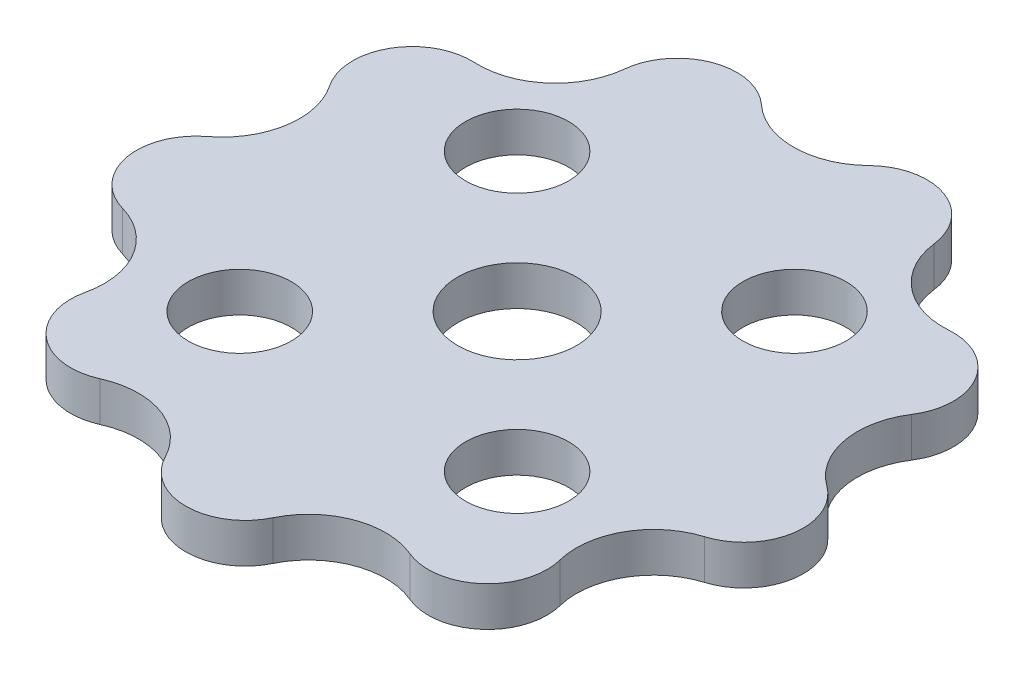
ISO-10303-21;
HEADER;
FILE_DESCRIPTION(('STEP AP214'),'2;1');
FILE_NAME('part.step','',(''),(''),'','','');
FILE_SCHEMA(('AUTOMOTIVE_DESIGN { 1 0 10303 214 1 1 1 1 }'));
ENDSEC;
DATA;
#1=APPLICATION_CONTEXT('core data for automotive mechanical design processes');
#2=APPLICATION_PROTOCOL_DEFINITION('international standard','automotive_design',2000,#1);
#3=PRODUCT_CONTEXT('',#1,'mechanical');
#4=PRODUCT('Part','Part','',(#3));
#5=PRODUCT_RELATED_PRODUCT_CATEGORY('part','',(#4));
#6=PRODUCT_DEFINITION_FORMATION('','',#4);
#7=PRODUCT_DEFINITION_CONTEXT('part definition',#1,'design');
#8=PRODUCT_DEFINITION('design','',#6,#7);
#9=PRODUCT_DEFINITION_SHAPE('','',#8);
#10=(LENGTH_UNIT() NAMED_UNIT(*) SI_UNIT(.MILLI.,.METRE.));
#11=(NAMED_UNIT(*) PLANE_ANGLE_UNIT() SI_UNIT($,.RADIAN.));
#12=(NAMED_UNIT(*) SI_UNIT($,.STERADIAN.) SOLID_ANGLE_UNIT());
#13=UNCERTAINTY_MEASURE_WITH_UNIT(LENGTH_MEASURE(1.E-05),#10,'distance_accuracy_value','');
#14=(GEOMETRIC_REPRESENTATION_CONTEXT(3) GLOBAL_UNCERTAINTY_ASSIGNED_CONTEXT((#13)) GLOBAL_UNIT_ASSIGNED_CONTEXT((#10,
#11,#12)) REPRESENTATION_CONTEXT('',''));
#15=CARTESIAN_POINT('',(0.,0.,0.));
#16=DIRECTION('',(0.,0.,1.));
#17=DIRECTION('',(1.,0.,0.));
#18=AXIS2_PLACEMENT_3D('',#15,#16,#17);
#19=CARTESIAN_POINT('',(22.9976137655761,10.,-65.5));
#20=DIRECTION('',(0.,-1.,0.));
#21=DIRECTION('',(0.,0.,-1.));
#22=AXIS2_PLACEMENT_3D('',#19,#20,#21);
#23=CYLINDRICAL_SURFACE('',#22,15.);
#24=CARTESIAN_POINT('',(22.9976137655761,0.,-65.5));
#25=DIRECTION('',(0.,1.,0.));
#26=DIRECTION('',(0.,0.,-1.));
#27=AXIS2_PLACEMENT_3D('',#24,#25,#26);
#28=CIRCLE('',#27,15.);
#29=CARTESIAN_POINT('',(37.8804715506332,0.,-67.3709741178769));
#30=VERTEX_POINT('',#29);
#31=CARTESIAN_POINT('',(12.5511192146518,0.,-76.2643277355119));
#32=VERTEX_POINT('',#31);
#33=EDGE_CURVE('E190',#30,#32,#28,.T.);
#34=ORIENTED_EDGE('',*,*,#33,.T.);
#35=DIRECTION('',(0.,-1.,0.));
#36=VECTOR('',#35,1.);
#37=CARTESIAN_POINT('',(12.5511192146518,10.,-76.2643277355119));
#38=LINE('',#37,#36);
#39=CARTESIAN_POINT('',(12.5511192146518,10.,-76.2643277355119));
#40=VERTEX_POINT('',#39);
#41=EDGE_CURVE('E11',#40,#32,#38,.T.);
#42=ORIENTED_EDGE('',*,*,#41,.F.);
#43=CARTESIAN_POINT('',(22.9976137655761,10.,-65.5));
#44=DIRECTION('',(0.,1.,0.));
#45=DIRECTION('',(0.,0.,-1.));
#46=AXIS2_PLACEMENT_3D('',#43,#44,#45);
#47=CIRCLE('',#46,15.);
#48=CARTESIAN_POINT('',(37.8804715506332,10.,-67.3709741178769));
#49=VERTEX_POINT('',#48);
#50=EDGE_CURVE('E225',#49,#40,#47,.T.);
#51=ORIENTED_EDGE('',*,*,#50,.F.);
#52=DIRECTION('',(0.,-1.,0.));
#53=VECTOR('',#52,1.);
#54=CARTESIAN_POINT('',(37.8804715506332,10.,-67.3709741178769));
#55=LINE('',#54,#53);
#56=EDGE_CURVE('E186',#49,#30,#55,.T.);
#57=ORIENTED_EDGE('',*,*,#56,.T.);
#58=EDGE_LOOP('',(#34,#42,#51,#57));
#59=FACE_BOUND('',#58,.T.);
#60=ADVANCED_FACE('F34',(#59),#23,.T.);
#61=CARTESIAN_POINT('',(-1.0293237015498,10.,-90.2579537916773));
#62=DIRECTION('',(0.,-1.,0.));
#63=DIRECTION('',(0.,0.,-1.));
#64=AXIS2_PLACEMENT_3D('',#61,#62,#63);
#65=CYLINDRICAL_SURFACE('',#64,19.5);
#66=CARTESIAN_POINT('',(-1.0293237015498,0.,-90.2579537916773));
#67=DIRECTION('',(0.,-1.,0.));
#68=DIRECTION('',(0.,0.,1.));
#69=AXIS2_PLACEMENT_3D('',#66,#67,#68);
#70=CIRCLE('',#69,19.5);
#71=CARTESIAN_POINT('',(-14.2871026813947,0.,-75.9582581123425));
#72=VERTEX_POINT('',#71);
#73=EDGE_CURVE('E193',#32,#72,#70,.T.);
#74=ORIENTED_EDGE('',*,*,#73,.T.);
#75=DIRECTION('',(0.,-1.,0.));
#76=VECTOR('',#75,1.);
#77=CARTESIAN_POINT('',(-14.2871026813947,10.,-75.9582581123425));
#78=LINE('',#77,#76);
#79=CARTESIAN_POINT('',(-14.2871026813947,10.,-75.9582581123425));
#80=VERTEX_POINT('',#79);
#81=EDGE_CURVE('E42',#80,#72,#78,.T.);
#82=ORIENTED_EDGE('',*,*,#81,.F.);
#83=CARTESIAN_POINT('',(-1.0293237015498,10.,-90.2579537916773));
#84=DIRECTION('',(0.,-1.,0.));
#85=DIRECTION('',(0.,0.,1.));
#86=AXIS2_PLACEMENT_3D('',#83,#84,#85);
#87=CIRCLE('',#86,19.5);
#88=EDGE_CURVE('E123',#40,#80,#87,.T.);
#89=ORIENTED_EDGE('',*,*,#88,.F.);
#90=ORIENTED_EDGE('',*,*,#41,.T.);
#91=EDGE_LOOP('',(#74,#82,#89,#90));
#92=FACE_BOUND('',#91,.T.);
#93=ADVANCED_FACE('F334',(#92),#65,.F.);
#94=CARTESIAN_POINT('',(-24.4853942043523,10.,-64.9584922051619));
#95=DIRECTION('',(0.,-1.,0.));
#96=DIRECTION('',(0.,0.,-1.));
#97=AXIS2_PLACEMENT_3D('',#94,#95,#96);
#98=CYLINDRICAL_SURFACE('',#97,15.0000000000001);
#99=CARTESIAN_POINT('',(-24.4853942043523,0.,-64.9584922051619));
#100=DIRECTION('',(0.,1.,0.));
#101=DIRECTION('',(0.,0.,-1.));
#102=AXIS2_PLACEMENT_3D('',#99,#100,#101);
#103=CIRCLE('',#102,15.0000000000001);
#104=CARTESIAN_POINT('',(-39.4070498001527,0.,-66.4895683888702));
#105=VERTEX_POINT('',#104);
#106=EDGE_CURVE('E196',#72,#105,#103,.T.);
#107=ORIENTED_EDGE('',*,*,#106,.T.);
#108=DIRECTION('',(0.,-1.,0.));
#109=VECTOR('',#108,1.);
#110=CARTESIAN_POINT('',(-39.4070498001527,10.,-66.4895683888702));
#111=LINE('',#110,#109);
#112=CARTESIAN_POINT('',(-39.4070498001527,10.,-66.4895683888702));
#113=VERTEX_POINT('',#112);
#114=EDGE_CURVE('E262',#113,#105,#111,.T.);
#115=ORIENTED_EDGE('',*,*,#114,.F.);
#116=CARTESIAN_POINT('',(-24.4853942043523,10.,-64.9584922051619));
#117=DIRECTION('',(0.,1.,0.));
#118=DIRECTION('',(0.,0.,-1.));
#119=AXIS2_PLACEMENT_3D('',#116,#117,#118);
#120=CIRCLE('',#119,15.0000000000001);
#121=EDGE_CURVE('E270',#80,#113,#120,.T.);
#122=ORIENTED_EDGE('',*,*,#121,.F.);
#123=ORIENTED_EDGE('',*,*,#81,.T.);
#124=EDGE_LOOP('',(#107,#115,#122,#123));
#125=FACE_BOUND('',#124,.T.);
#126=ADVANCED_FACE('F268',(#125),#98,.T.);
#127=CARTESIAN_POINT('',(-58.8052020746933,10.,-68.4799674276909));
#128=DIRECTION('',(0.,-1.,0.));
#129=DIRECTION('',(0.,0.,-1.));
#130=AXIS2_PLACEMENT_3D('',#127,#128,#129);
#131=CYLINDRICAL_SURFACE('',#130,19.5);
#132=CARTESIAN_POINT('',(-58.8052020746933,0.,-68.4799674276909));
#133=DIRECTION('',(0.,-1.,0.));
#134=DIRECTION('',(0.,0.,1.));
#135=AXIS2_PLACEMENT_3D('',#132,#133,#134);
#136=CIRCLE('',#135,19.5);
#137=CARTESIAN_POINT('',(-59.7695827853385,0.,-49.0038289540372));
#138=VERTEX_POINT('',#137);
#139=EDGE_CURVE('E198',#105,#138,#136,.T.);
#140=ORIENTED_EDGE('',*,*,#139,.T.);
#141=DIRECTION('',(0.,-1.,0.));
#142=VECTOR('',#141,1.);
#143=CARTESIAN_POINT('',(-59.7695827853385,10.,-49.0038289540372));
#144=LINE('',#143,#142);
#145=CARTESIAN_POINT('',(-59.7695827853385,10.,-49.0038289540372));
#146=VERTEX_POINT('',#145);
#147=EDGE_CURVE('E259',#146,#138,#144,.T.);
#148=ORIENTED_EDGE('',*,*,#147,.F.);
#149=CARTESIAN_POINT('',(-58.8052020746933,10.,-68.4799674276909));
#150=DIRECTION('',(0.,-1.,0.));
#151=DIRECTION('',(0.,0.,1.));
#152=AXIS2_PLACEMENT_3D('',#149,#150,#151);
#153=CIRCLE('',#152,19.5);
#154=EDGE_CURVE('E288',#113,#146,#153,.T.);
#155=ORIENTED_EDGE('',*,*,#154,.F.);
#156=ORIENTED_EDGE('',*,*,#114,.T.);
#157=EDGE_LOOP('',(#140,#148,#155,#156));
#158=FACE_BOUND('',#157,.T.);
#159=ADVANCED_FACE('F279',(#158),#131,.F.);
#160=CARTESIAN_POINT('',(-60.5114141012195,10.,-34.0221839743035));
#161=DIRECTION('',(0.,-1.,0.));
#162=DIRECTION('',(0.,0.,-1.));
#163=AXIS2_PLACEMENT_3D('',#160,#161,#162);
#164=CYLINDRICAL_SURFACE('',#163,15.);
#165=CARTESIAN_POINT('',(-60.5114141012195,0.,-34.0221839743035));
#166=DIRECTION('',(0.,1.,0.));
#167=DIRECTION('',(0.,0.,-1.));
#168=AXIS2_PLACEMENT_3D('',#165,#166,#167);
#169=CIRCLE('',#168,15.);
#170=CARTESIAN_POINT('',(-72.9262222528914,0.,-25.6036010438347));
#171=VERTEX_POINT('',#170);
#172=EDGE_CURVE('E200',#138,#171,#169,.T.);
#173=ORIENTED_EDGE('',*,*,#172,.T.);
#174=DIRECTION('',(0.,-1.,0.));
#175=VECTOR('',#174,1.);
#176=CARTESIAN_POINT('',(-72.9262222528914,10.,-25.6036010438347));
#177=LINE('',#176,#175);
#178=CARTESIAN_POINT('',(-72.9262222528914,10.,-25.6036010438347));
#179=VERTEX_POINT('',#178);
#180=EDGE_CURVE('E256',#179,#171,#177,.T.);
#181=ORIENTED_EDGE('',*,*,#180,.F.);
#182=CARTESIAN_POINT('',(-60.5114141012195,10.,-34.0221839743035));
#183=DIRECTION('',(0.,1.,0.));
#184=DIRECTION('',(0.,0.,-1.));
#185=AXIS2_PLACEMENT_3D('',#182,#183,#184);
#186=CIRCLE('',#185,15.);
#187=EDGE_CURVE('E285',#146,#179,#186,.T.);
#188=ORIENTED_EDGE('',*,*,#187,.F.);
#189=ORIENTED_EDGE('',*,*,#147,.T.);
#190=EDGE_LOOP('',(#173,#181,#188,#189));
#191=FACE_BOUND('',#190,.T.);
#192=ADVANCED_FACE('F283',(#191),#164,.T.);
#193=CARTESIAN_POINT('',(-89.0654728500649,10.,-14.6594432342253));
#194=DIRECTION('',(0.,-1.,0.));
#195=DIRECTION('',(0.,0.,-1.));
#196=AXIS2_PLACEMENT_3D('',#193,#194,#195);
#197=CYLINDRICAL_SURFACE('',#196,19.5);
#198=CARTESIAN_POINT('',(-89.0654728500649,0.,-14.6594432342253));
#199=DIRECTION('',(0.,-1.,0.));
#200=DIRECTION('',(0.,0.,1.));
#201=AXIS2_PLACEMENT_3D('',#198,#199,#200);
#202=CIRCLE('',#201,19.5);
#203=CARTESIAN_POINT('',(-77.2852108391019,0.,0.880036388756384));
#204=VERTEX_POINT('',#203);
#205=EDGE_CURVE('E202',#171,#204,#202,.T.);
#206=ORIENTED_EDGE('',*,*,#205,.T.);
#207=DIRECTION('',(0.,-1.,0.));
#208=VECTOR('',#207,1.);
#209=CARTESIAN_POINT('',(-77.2852108391019,10.,0.880036388756384));
#210=LINE('',#209,#208);
#211=CARTESIAN_POINT('',(-77.2852108391019,10.,0.880036388756384));
#212=VERTEX_POINT('',#211);
#213=EDGE_CURVE('E253',#212,#204,#210,.T.);
#214=ORIENTED_EDGE('',*,*,#213,.F.);
#215=CARTESIAN_POINT('',(-89.0654728500649,10.,-14.6594432342253));
#216=DIRECTION('',(0.,-1.,0.));
#217=DIRECTION('',(0.,0.,1.));
#218=AXIS2_PLACEMENT_3D('',#215,#216,#217);
#219=CIRCLE('',#218,19.5);
#220=EDGE_CURVE('E287',#179,#212,#219,.T.);
#221=ORIENTED_EDGE('',*,*,#220,.F.);
#222=ORIENTED_EDGE('',*,*,#180,.T.);
#223=EDGE_LOOP('',(#206,#214,#221,#222));
#224=FACE_BOUND('',#223,.T.);
#225=ADVANCED_FACE('F347',(#224),#197,.F.);
#226=CARTESIAN_POINT('',(-68.2234708306688,10.,12.8334822525885));
#227=DIRECTION('',(0.,-1.,0.));
#228=DIRECTION('',(0.,0.,-1.));
#229=AXIS2_PLACEMENT_3D('',#226,#227,#228);
#230=CYLINDRICAL_SURFACE('',#229,15.);
#231=CARTESIAN_POINT('',(-68.2234708306688,0.,12.8334822525885));
#232=DIRECTION('',(0.,1.,0.));
#233=DIRECTION('',(0.,0.,-1.));
#234=AXIS2_PLACEMENT_3D('',#231,#232,#233);
#235=CIRCLE('',#234,15.);
#236=CARTESIAN_POINT('',(-72.3224048288213,0.,27.2625757819406));
#237=VERTEX_POINT('',#236);
#238=EDGE_CURVE('E204',#204,#237,#235,.T.);
#239=ORIENTED_EDGE('',*,*,#238,.T.);
#240=DIRECTION('',(0.,-1.,0.));
#241=VECTOR('',#240,1.);
#242=CARTESIAN_POINT('',(-72.3224048288213,10.,27.2625757819406));
#243=LINE('',#242,#241);
#244=CARTESIAN_POINT('',(-72.3224048288213,10.,27.2625757819406));
#245=VERTEX_POINT('',#244);
#246=EDGE_CURVE('E250',#245,#237,#243,.T.);
#247=ORIENTED_EDGE('',*,*,#246,.F.);
#248=CARTESIAN_POINT('',(-68.2234708306688,10.,12.8334822525885));
#249=DIRECTION('',(0.,1.,0.));
#250=DIRECTION('',(0.,0.,-1.));
#251=AXIS2_PLACEMENT_3D('',#248,#249,#250);
#252=CIRCLE('',#251,15.);
#253=EDGE_CURVE('E290',#212,#245,#252,.T.);
#254=ORIENTED_EDGE('',*,*,#253,.F.);
#255=ORIENTED_EDGE('',*,*,#213,.T.);
#256=EDGE_LOOP('',(#239,#247,#254,#255));
#257=FACE_BOUND('',#256,.T.);
#258=ADVANCED_FACE('F350',(#257),#230,.T.);
#259=CARTESIAN_POINT('',(-77.6510190264196,10.,46.0203973700982));
#260=DIRECTION('',(0.,-1.,0.));
#261=DIRECTION('',(0.,0.,-1.));
#262=AXIS2_PLACEMENT_3D('',#259,#260,#261);
#263=CYLINDRICAL_SURFACE('',#262,19.5);
#264=CARTESIAN_POINT('',(-77.6510190264196,0.,46.0203973700982));
#265=DIRECTION('',(0.,-1.,0.));
#266=DIRECTION('',(0.,0.,1.));
#267=AXIS2_PLACEMENT_3D('',#264,#265,#266);
#268=CIRCLE('',#267,19.5);
#269=CARTESIAN_POINT('',(-58.6382298118067,0.,50.3521229247358));
#270=VERTEX_POINT('',#269);
#271=EDGE_CURVE('E206',#237,#270,#268,.T.);
#272=ORIENTED_EDGE('',*,*,#271,.T.);
#273=DIRECTION('',(0.,-1.,0.));
#274=VECTOR('',#273,1.);
#275=CARTESIAN_POINT('',(-58.6382298118067,10.,50.3521229247358));
#276=LINE('',#275,#274);
#277=CARTESIAN_POINT('',(-58.6382298118067,10.,50.3521229247358));
#278=VERTEX_POINT('',#277);
#279=EDGE_CURVE('E247',#278,#270,#276,.T.);
#280=ORIENTED_EDGE('',*,*,#279,.F.);
#281=CARTESIAN_POINT('',(-77.6510190264196,10.,46.0203973700982));
#282=DIRECTION('',(0.,-1.,0.));
#283=DIRECTION('',(0.,0.,1.));
#284=AXIS2_PLACEMENT_3D('',#281,#282,#283);
#285=CIRCLE('',#284,19.5);
#286=EDGE_CURVE('E296',#245,#278,#285,.T.);
#287=ORIENTED_EDGE('',*,*,#286,.F.);
#288=ORIENTED_EDGE('',*,*,#246,.T.);
#289=EDGE_LOOP('',(#272,#280,#287,#288));
#290=FACE_BOUND('',#289,.T.);
#291=ADVANCED_FACE('F354',(#290),#263,.F.);
#292=CARTESIAN_POINT('',(-44.0130073390276,10.,53.6842195052263));
#293=DIRECTION('',(0.,-1.,0.));
#294=DIRECTION('',(0.,0.,-1.));
#295=AXIS2_PLACEMENT_3D('',#292,#293,#294);
#296=CYLINDRICAL_SURFACE('',#295,15.);
#297=CARTESIAN_POINT('',(-44.0130073390276,0.,53.6842195052263));
#298=DIRECTION('',(0.,1.,0.));
#299=DIRECTION('',(0.,0.,-1.));
#300=AXIS2_PLACEMENT_3D('',#297,#298,#299);
#301=CIRCLE('',#300,15.);
#302=CARTESIAN_POINT('',(-37.878130411348,0.,67.3722904095658));
#303=VERTEX_POINT('',#302);
#304=EDGE_CURVE('E208',#270,#303,#301,.T.);
#305=ORIENTED_EDGE('',*,*,#304,.T.);
#306=DIRECTION('',(0.,-1.,0.));
#307=VECTOR('',#306,1.);
#308=CARTESIAN_POINT('',(-37.878130411348,10.,67.3722904095658));
#309=LINE('',#308,#307);
#310=CARTESIAN_POINT('',(-37.878130411348,10.,67.3722904095658));
#311=VERTEX_POINT('',#310);
#312=EDGE_CURVE('E244',#311,#303,#309,.T.);
#313=ORIENTED_EDGE('',*,*,#312,.F.);
#314=CARTESIAN_POINT('',(-44.0130073390276,10.,53.6842195052263));
#315=DIRECTION('',(0.,1.,0.));
#316=DIRECTION('',(0.,0.,-1.));
#317=AXIS2_PLACEMENT_3D('',#314,#315,#316);
#318=CIRCLE('',#317,15.);
#319=EDGE_CURVE('E298',#278,#311,#318,.T.);
#320=ORIENTED_EDGE('',*,*,#319,.F.);
#321=ORIENTED_EDGE('',*,*,#279,.T.);
#322=EDGE_LOOP('',(#305,#313,#320,#321));
#323=FACE_BOUND('',#322,.T.);
#324=ADVANCED_FACE('F358',(#323),#296,.T.);
#325=CARTESIAN_POINT('',(-29.9027904053647,10.,85.1667825852072));
#326=DIRECTION('',(0.,-1.,0.));
#327=DIRECTION('',(0.,0.,-1.));
#328=AXIS2_PLACEMENT_3D('',#325,#326,#327);
#329=CYLINDRICAL_SURFACE('',#328,19.5);
#330=CARTESIAN_POINT('',(-29.9027904053647,0.,85.1667825852072));
#331=DIRECTION('',(0.,-1.,0.));
#332=DIRECTION('',(0.,0.,1.));
#333=AXIS2_PLACEMENT_3D('',#330,#331,#332);
#334=CIRCLE('',#333,19.5);
#335=CARTESIAN_POINT('',(-12.5537693642344,0.,76.2638915427188));
#336=VERTEX_POINT('',#335);
#337=EDGE_CURVE('E210',#303,#336,#334,.T.);
#338=ORIENTED_EDGE('',*,*,#337,.T.);
#339=DIRECTION('',(0.,-1.,0.));
#340=VECTOR('',#339,1.);
#341=CARTESIAN_POINT('',(-12.5537693642344,10.,76.2638915427188));
#342=LINE('',#341,#340);
#343=CARTESIAN_POINT('',(-12.5537693642344,10.,76.2638915427188));
#344=VERTEX_POINT('',#343);
#345=EDGE_CURVE('E241',#344,#336,#342,.T.);
#346=ORIENTED_EDGE('',*,*,#345,.F.);
#347=CARTESIAN_POINT('',(-29.9027904053647,10.,85.1667825852072));
#348=DIRECTION('',(0.,-1.,0.));
#349=DIRECTION('',(0.,0.,1.));
#350=AXIS2_PLACEMENT_3D('',#347,#348,#349);
#351=CIRCLE('',#350,19.5);
#352=EDGE_CURVE('E300',#311,#344,#351,.T.);
#353=ORIENTED_EDGE('',*,*,#352,.F.);
#354=ORIENTED_EDGE('',*,*,#312,.T.);
#355=EDGE_LOOP('',(#338,#346,#353,#354));
#356=FACE_BOUND('',#355,.T.);
#357=ADVANCED_FACE('F362',(#356),#329,.F.);
#358=CARTESIAN_POINT('',(0.791631436635062,10.,69.4155138177277));
#359=DIRECTION('',(0.,-1.,0.));
#360=DIRECTION('',(0.,0.,-1.));
#361=AXIS2_PLACEMENT_3D('',#358,#359,#360);
#362=CYLINDRICAL_SURFACE('',#361,15.0000000000001);
#363=CARTESIAN_POINT('',(0.791631436635062,0.,69.4155138177277));
#364=DIRECTION('',(0.,1.,0.));
#365=DIRECTION('',(0.,0.,-1.));
#366=AXIS2_PLACEMENT_3D('',#363,#364,#365);
#367=CIRCLE('',#366,15.0000000000001);
#368=CARTESIAN_POINT('',(14.2897421941231,0.,75.9577615949514));
#369=VERTEX_POINT('',#368);
#370=EDGE_CURVE('E212',#336,#369,#367,.T.);
#371=ORIENTED_EDGE('',*,*,#370,.T.);
#372=DIRECTION('',(0.,-1.,0.));
#373=VECTOR('',#372,1.);
#374=CARTESIAN_POINT('',(14.2897421941231,10.,75.9577615949514));
#375=LINE('',#374,#373);
#376=CARTESIAN_POINT('',(14.2897421941231,10.,75.9577615949514));
#377=VERTEX_POINT('',#376);
#378=EDGE_CURVE('E238',#377,#369,#375,.T.);
#379=ORIENTED_EDGE('',*,*,#378,.F.);
#380=CARTESIAN_POINT('',(0.791631436635062,10.,69.4155138177277));
#381=DIRECTION('',(0.,1.,0.));
#382=DIRECTION('',(0.,0.,-1.));
#383=AXIS2_PLACEMENT_3D('',#380,#381,#382);
#384=CIRCLE('',#383,15.0000000000001);
#385=EDGE_CURVE('E302',#344,#377,#384,.T.);
#386=ORIENTED_EDGE('',*,*,#385,.F.);
#387=ORIENTED_EDGE('',*,*,#345,.T.);
#388=EDGE_LOOP('',(#371,#379,#386,#387));
#389=FACE_BOUND('',#388,.T.);
#390=ADVANCED_FACE('F366',(#389),#362,.T.);
#391=CARTESIAN_POINT('',(31.8372861788574,10.,84.4626837053421));
#392=DIRECTION('',(0.,-1.,0.));
#393=DIRECTION('',(0.,0.,-1.));
#394=AXIS2_PLACEMENT_3D('',#391,#392,#393);
#395=CYLINDRICAL_SURFACE('',#394,19.5);
#396=CARTESIAN_POINT('',(31.8372861788574,0.,84.4626837053421));
#397=DIRECTION('',(0.,-1.,0.));
#398=DIRECTION('',(0.,0.,1.));
#399=AXIS2_PLACEMENT_3D('',#396,#397,#398);
#400=CIRCLE('',#399,19.5);
#401=CARTESIAN_POINT('',(39.4047392884687,0.,66.4909377291205));
#402=VERTEX_POINT('',#401);
#403=EDGE_CURVE('E214',#369,#402,#400,.T.);
#404=ORIENTED_EDGE('',*,*,#403,.T.);
#405=DIRECTION('',(0.,-1.,0.));
#406=VECTOR('',#405,1.);
#407=CARTESIAN_POINT('',(39.4047392884687,10.,66.4909377291205));
#408=LINE('',#407,#406);
#409=CARTESIAN_POINT('',(39.4047392884687,10.,66.4909377291205));
#410=VERTEX_POINT('',#409);
#411=EDGE_CURVE('E235',#410,#402,#408,.T.);
#412=ORIENTED_EDGE('',*,*,#411,.F.);
#413=CARTESIAN_POINT('',(31.8372861788574,10.,84.4626837053421));
#414=DIRECTION('',(0.,-1.,0.));
#415=DIRECTION('',(0.,0.,1.));
#416=AXIS2_PLACEMENT_3D('',#413,#414,#415);
#417=CIRCLE('',#416,19.5);
#418=EDGE_CURVE('E304',#377,#410,#417,.T.);
#419=ORIENTED_EDGE('',*,*,#418,.F.);
#420=ORIENTED_EDGE('',*,*,#378,.T.);
#421=EDGE_LOOP('',(#404,#412,#419,#420));
#422=FACE_BOUND('',#421,.T.);
#423=ADVANCED_FACE('F370',(#422),#395,.F.);
#424=CARTESIAN_POINT('',(45.2258570650927,10.,52.6665177474116));
#425=DIRECTION('',(0.,-1.,0.));
#426=DIRECTION('',(0.,0.,-1.));
#427=AXIS2_PLACEMENT_3D('',#424,#425,#426);
#428=CYLINDRICAL_SURFACE('',#427,15.0000000000001);
#429=CARTESIAN_POINT('',(45.2258570650927,0.,52.6665177474116));
#430=DIRECTION('',(0.,1.,0.));
#431=DIRECTION('',(0.,0.,-1.));
#432=AXIS2_PLACEMENT_3D('',#429,#430,#431);
#433=CIRCLE('',#432,15.0000000000001);
#434=CARTESIAN_POINT('',(59.7712856141696,0.,49.0017519535713));
#435=VERTEX_POINT('',#434);
#436=EDGE_CURVE('E216',#402,#435,#433,.T.);
#437=ORIENTED_EDGE('',*,*,#436,.T.);
#438=DIRECTION('',(0.,-1.,0.));
#439=VECTOR('',#438,1.);
#440=CARTESIAN_POINT('',(59.7712856141696,10.,49.0017519535713));
#441=LINE('',#440,#439);
#442=CARTESIAN_POINT('',(59.7712856141696,10.,49.0017519535713));
#443=VERTEX_POINT('',#442);
#444=EDGE_CURVE('E232',#443,#435,#441,.T.);
#445=ORIENTED_EDGE('',*,*,#444,.F.);
#446=CARTESIAN_POINT('',(45.2258570650927,10.,52.6665177474116));
#447=DIRECTION('',(0.,1.,0.));
#448=DIRECTION('',(0.,0.,-1.));
#449=AXIS2_PLACEMENT_3D('',#446,#447,#448);
#450=CIRCLE('',#449,15.0000000000001);
#451=EDGE_CURVE('E306',#410,#443,#450,.T.);
#452=ORIENTED_EDGE('',*,*,#451,.F.);
#453=ORIENTED_EDGE('',*,*,#411,.T.);
#454=EDGE_LOOP('',(#437,#445,#452,#453));
#455=FACE_BOUND('',#454,.T.);
#456=ADVANCED_FACE('F374',(#455),#428,.T.);
#457=CARTESIAN_POINT('',(78.6803427279694,10.,44.2375564215791));
#458=DIRECTION('',(0.,-1.,0.));
#459=DIRECTION('',(0.,0.,-1.));
#460=AXIS2_PLACEMENT_3D('',#457,#458,#459);
#461=CYLINDRICAL_SURFACE('',#460,19.5);
#462=CARTESIAN_POINT('',(78.6803427279694,0.,44.2375564215791));
#463=DIRECTION('',(0.,-1.,0.));
#464=DIRECTION('',(0.,0.,1.));
#465=AXIS2_PLACEMENT_3D('',#462,#463,#464);
#466=CIRCLE('',#465,19.5);
#467=CARTESIAN_POINT('',(72.9253324932014,0.,25.6061351876067));
#468=VERTEX_POINT('',#467);
#469=EDGE_CURVE('E218',#435,#468,#466,.T.);
#470=ORIENTED_EDGE('',*,*,#469,.T.);
#471=DIRECTION('',(0.,-1.,0.));
#472=VECTOR('',#471,1.);
#473=CARTESIAN_POINT('',(72.9253324932014,10.,25.6061351876067));
#474=LINE('',#473,#472);
#475=CARTESIAN_POINT('',(72.9253324932014,10.,25.6061351876067));
#476=VERTEX_POINT('',#475);
#477=EDGE_CURVE('E229',#476,#468,#474,.T.);
#478=ORIENTED_EDGE('',*,*,#477,.F.);
#479=CARTESIAN_POINT('',(78.6803427279694,10.,44.2375564215791));
#480=DIRECTION('',(0.,-1.,0.));
#481=DIRECTION('',(0.,0.,1.));
#482=AXIS2_PLACEMENT_3D('',#479,#480,#481);
#483=CIRCLE('',#482,19.5);
#484=EDGE_CURVE('E308',#443,#476,#483,.T.);
#485=ORIENTED_EDGE('',*,*,#484,.F.);
#486=ORIENTED_EDGE('',*,*,#444,.T.);
#487=EDGE_LOOP('',(#470,#478,#485,#486));
#488=FACE_BOUND('',#487,.T.);
#489=ADVANCED_FACE('F314',(#488),#461,.F.);
#490=CARTESIAN_POINT('',(68.4984015433798,10.,11.2742726999356));
#491=DIRECTION('',(0.,-1.,0.));
#492=DIRECTION('',(0.,0.,-1.));
#493=AXIS2_PLACEMENT_3D('',#490,#491,#492);
#494=CYLINDRICAL_SURFACE('',#493,15.);
#495=CARTESIAN_POINT('',(68.4984015433798,0.,11.2742726999356));
#496=DIRECTION('',(0.,1.,0.));
#497=DIRECTION('',(0.,0.,-1.));
#498=AXIS2_PLACEMENT_3D('',#495,#496,#497);
#499=CIRCLE('',#498,15.);
#500=CARTESIAN_POINT('',(77.2851802115007,0.,-0.882722020695621));
#501=VERTEX_POINT('',#500);
#502=EDGE_CURVE('E220',#468,#501,#499,.T.);
#503=ORIENTED_EDGE('',*,*,#502,.T.);
#504=DIRECTION('',(0.,-1.,0.));
#505=VECTOR('',#504,1.);
#506=CARTESIAN_POINT('',(77.2851802115007,10.,-0.882722020695621));
#507=LINE('',#506,#505);
#508=CARTESIAN_POINT('',(77.2851802115007,10.,-0.882722020695621));
#509=VERTEX_POINT('',#508);
#510=EDGE_CURVE('E181',#509,#501,#507,.T.);
#511=ORIENTED_EDGE('',*,*,#510,.F.);
#512=CARTESIAN_POINT('',(68.4984015433798,10.,11.2742726999356));
#513=DIRECTION('',(0.,1.,0.));
#514=DIRECTION('',(0.,0.,-1.));
#515=AXIS2_PLACEMENT_3D('',#512,#513,#514);
#516=CIRCLE('',#515,15.);
#517=EDGE_CURVE('E172',#476,#509,#516,.T.);
#518=ORIENTED_EDGE('',*,*,#517,.F.);
#519=ORIENTED_EDGE('',*,*,#477,.T.);
#520=EDGE_LOOP('',(#503,#511,#518,#519));
#521=FACE_BOUND('',#520,.T.);
#522=ADVANCED_FACE('F318',(#521),#494,.T.);
#523=CARTESIAN_POINT('',(88.7079924800579,10.,-16.6868151575162));
#524=DIRECTION('',(0.,-1.,0.));
#525=DIRECTION('',(0.,0.,-1.));
#526=AXIS2_PLACEMENT_3D('',#523,#524,#525);
#527=CYLINDRICAL_SURFACE('',#526,19.5);
#528=CARTESIAN_POINT('',(88.7079924800579,0.,-16.6868151575162));
#529=DIRECTION('',(0.,-1.,0.));
#530=DIRECTION('',(0.,0.,1.));
#531=AXIS2_PLACEMENT_3D('',#528,#529,#530);
#532=CIRCLE('',#531,19.5);
#533=CARTESIAN_POINT('',(72.3233521495729,0.,-27.2600625886816));
#534=VERTEX_POINT('',#533);
#535=EDGE_CURVE('E180',#501,#534,#532,.T.);
#536=ORIENTED_EDGE('',*,*,#535,.T.);
#537=DIRECTION('',(0.,-1.,0.));
#538=VECTOR('',#537,1.);
#539=CARTESIAN_POINT('',(72.3233521495729,10.,-27.2600625886816));
#540=LINE('',#539,#538);
#541=CARTESIAN_POINT('',(72.3233521495729,10.,-27.2600625886816));
#542=VERTEX_POINT('',#541);
#543=EDGE_CURVE('E177',#542,#534,#540,.T.);
#544=ORIENTED_EDGE('',*,*,#543,.F.);
#545=CARTESIAN_POINT('',(88.7079924800579,10.,-16.6868151575162));
#546=DIRECTION('',(0.,-1.,0.));
#547=DIRECTION('',(0.,0.,1.));
#548=AXIS2_PLACEMENT_3D('',#545,#546,#547);
#549=CIRCLE('',#548,19.5);
#550=EDGE_CURVE('E166',#509,#542,#549,.T.);
#551=ORIENTED_EDGE('',*,*,#550,.F.);
#552=ORIENTED_EDGE('',*,*,#510,.T.);
#553=EDGE_LOOP('',(#536,#544,#551,#552));
#554=FACE_BOUND('',#553,.T.);
#555=ADVANCED_FACE('F178',(#554),#527,.F.);
#556=CARTESIAN_POINT('',(59.7197826645844,10.,-35.3933298434242));
#557=DIRECTION('',(0.,-1.,0.));
#558=DIRECTION('',(0.,0.,-1.));
#559=AXIS2_PLACEMENT_3D('',#556,#557,#558);
#560=CYLINDRICAL_SURFACE('',#559,15.);
#561=CARTESIAN_POINT('',(59.7197826645844,0.,-35.3933298434242));
#562=DIRECTION('',(0.,1.,0.));
#563=DIRECTION('',(0.,0.,-1.));
#564=AXIS2_PLACEMENT_3D('',#561,#562,#563);
#565=CIRCLE('',#564,15.);
#566=CARTESIAN_POINT('',(58.6364800587683,0.,-50.3541605511166));
#567=VERTEX_POINT('',#566);
#568=EDGE_CURVE('E109',#534,#567,#565,.T.);
#569=ORIENTED_EDGE('',*,*,#568,.T.);
#570=DIRECTION('',(0.,-1.,0.));
#571=VECTOR('',#570,1.);
#572=CARTESIAN_POINT('',(58.6364800587683,10.,-50.3541605511166));
#573=LINE('',#572,#571);
#574=CARTESIAN_POINT('',(58.6364800587683,10.,-50.3541605511166));
#575=VERTEX_POINT('',#574);
#576=EDGE_CURVE('E182',#575,#567,#573,.T.);
#577=ORIENTED_EDGE('',*,*,#576,.F.);
#578=CARTESIAN_POINT('',(59.7197826645844,10.,-35.3933298434242));
#579=DIRECTION('',(0.,1.,0.));
#580=DIRECTION('',(0.,0.,-1.));
#581=AXIS2_PLACEMENT_3D('',#578,#579,#580);
#582=CIRCLE('',#581,15.);
#583=EDGE_CURVE('E170',#542,#575,#582,.T.);
#584=ORIENTED_EDGE('',*,*,#583,.F.);
#585=ORIENTED_EDGE('',*,*,#543,.T.);
#586=EDGE_LOOP('',(#569,#577,#584,#585));
#587=FACE_BOUND('',#586,.T.);
#588=ADVANCED_FACE('F184',(#587),#560,.T.);
#589=CARTESIAN_POINT('',(57.2281866712075,10.,-69.8032404711168));
#590=DIRECTION('',(0.,-1.,0.));
#591=DIRECTION('',(0.,0.,-1.));
#592=AXIS2_PLACEMENT_3D('',#589,#590,#591);
#593=CYLINDRICAL_SURFACE('',#592,19.5);
#594=CARTESIAN_POINT('',(57.2281866712075,0.,-69.8032404711168));
#595=DIRECTION('',(0.,-1.,0.));
#596=DIRECTION('',(0.,0.,1.));
#597=AXIS2_PLACEMENT_3D('',#594,#595,#596);
#598=CIRCLE('',#597,19.5);
#599=EDGE_CURVE('E115',#567,#30,#598,.T.);
#600=ORIENTED_EDGE('',*,*,#599,.T.);
#601=ORIENTED_EDGE('',*,*,#56,.F.);
#602=CARTESIAN_POINT('',(57.2281866712075,10.,-69.8032404711168));
#603=DIRECTION('',(0.,-1.,0.));
#604=DIRECTION('',(0.,0.,1.));
#605=AXIS2_PLACEMENT_3D('',#602,#603,#604);
#606=CIRCLE('',#605,19.5);
#607=EDGE_CURVE('E50',#575,#49,#606,.T.);
#608=ORIENTED_EDGE('',*,*,#607,.F.);
#609=ORIENTED_EDGE('',*,*,#576,.T.);
#610=EDGE_LOOP('',(#600,#601,#608,#609));
#611=FACE_BOUND('',#610,.T.);
#612=ADVANCED_FACE('F322',(#611),#593,.F.);
#613=CARTESIAN_POINT('',(40.1129002183918,10.,-67.6516202355584));
#614=DIRECTION('',(0.,-1.,0.));
#615=DIRECTION('',(0.,0.,-1.));
#616=AXIS2_PLACEMENT_3D('',#613,#614,#615);
#617=PLANE('',#616);
#618=CARTESIAN_POINT('',(0.,10.,0.));
#619=DIRECTION('',(0.,1.,0.));
#620=DIRECTION('',(0.,0.,1.));
#621=AXIS2_PLACEMENT_3D('',#618,#619,#620);
#622=CIRCLE('',#621,15.);
#623=CARTESIAN_POINT('',(0.,10.,15.));
#624=VERTEX_POINT('',#623);
#625=EDGE_CURVE('E470',#624,#624,#622,.T.);
#626=ORIENTED_EDGE('',*,*,#625,.F.);
#627=EDGE_LOOP('',(#626));
#628=FACE_BOUND('',#627,.T.);
#629=CARTESIAN_POINT('',(34.9999999999987,10.,-35.0000000000001));
#630=DIRECTION('',(0.,1.,0.));
#631=DIRECTION('',(0.,0.,1.));
#632=AXIS2_PLACEMENT_3D('',#629,#630,#631);
#633=CIRCLE('',#632,13.);
#634=CARTESIAN_POINT('',(34.9999999999987,10.,-22.0000000000001));
#635=VERTEX_POINT('',#634);
#636=EDGE_CURVE('E472',#635,#635,#633,.T.);
#637=ORIENTED_EDGE('',*,*,#636,.F.);
#638=EDGE_LOOP('',(#637));
#639=FACE_BOUND('',#638,.T.);
#640=CARTESIAN_POINT('',(-35.0000000000014,10.,-34.9999999999987));
#641=DIRECTION('',(0.,1.,0.));
#642=DIRECTION('',(0.,0.,1.));
#643=AXIS2_PLACEMENT_3D('',#640,#641,#642);
#644=CIRCLE('',#643,13.);
#645=CARTESIAN_POINT('',(-35.0000000000014,10.,-21.9999999999987));
#646=VERTEX_POINT('',#645);
#647=EDGE_CURVE('E478',#646,#646,#644,.T.);
#648=ORIENTED_EDGE('',*,*,#647,.F.);
#649=EDGE_LOOP('',(#648));
#650=FACE_BOUND('',#649,.T.);
#651=CARTESIAN_POINT('',(-35.,10.,35.0000000000014));
#652=DIRECTION('',(0.,1.,0.));
#653=DIRECTION('',(0.,0.,1.));
#654=AXIS2_PLACEMENT_3D('',#651,#652,#653);
#655=CIRCLE('',#654,13.);
#656=CARTESIAN_POINT('',(-35.,10.,48.0000000000014));
#657=VERTEX_POINT('',#656);
#658=EDGE_CURVE('E484',#657,#657,#655,.T.);
#659=ORIENTED_EDGE('',*,*,#658,.F.);
#660=EDGE_LOOP('',(#659));
#661=FACE_BOUND('',#660,.T.);
#662=CARTESIAN_POINT('',(35.0000000000006,10.,35.));
#663=DIRECTION('',(0.,1.,0.));
#664=DIRECTION('',(0.,0.,1.));
#665=AXIS2_PLACEMENT_3D('',#662,#663,#664);
#666=CIRCLE('',#665,13.);
#667=CARTESIAN_POINT('',(35.0000000000006,10.,48.));
#668=VERTEX_POINT('',#667);
#669=EDGE_CURVE('E490',#668,#668,#666,.T.);
#670=ORIENTED_EDGE('',*,*,#669,.F.);
#671=EDGE_LOOP('',(#670));
#672=FACE_BOUND('',#671,.T.);
#673=ORIENTED_EDGE('',*,*,#50,.T.);
#674=ORIENTED_EDGE('',*,*,#88,.T.);
#675=ORIENTED_EDGE('',*,*,#121,.T.);
#676=ORIENTED_EDGE('',*,*,#154,.T.);
#677=ORIENTED_EDGE('',*,*,#187,.T.);
#678=ORIENTED_EDGE('',*,*,#220,.T.);
#679=ORIENTED_EDGE('',*,*,#253,.T.);
#680=ORIENTED_EDGE('',*,*,#286,.T.);
#681=ORIENTED_EDGE('',*,*,#319,.T.);
#682=ORIENTED_EDGE('',*,*,#352,.T.);
#683=ORIENTED_EDGE('',*,*,#385,.T.);
#684=ORIENTED_EDGE('',*,*,#418,.T.);
#685=ORIENTED_EDGE('',*,*,#451,.T.);
#686=ORIENTED_EDGE('',*,*,#484,.T.);
#687=ORIENTED_EDGE('',*,*,#517,.T.);
#688=ORIENTED_EDGE('',*,*,#550,.T.);
#689=ORIENTED_EDGE('',*,*,#583,.T.);
#690=ORIENTED_EDGE('',*,*,#607,.T.);
#691=EDGE_LOOP('',(#673,#674,#675,#676,#677,#678,#679,#680,#681,#682,#683,#684,#685,#686,#687,
#688,#689,#690));
#692=FACE_BOUND('',#691,.T.);
#693=ADVANCED_FACE('F168',(#628,#639,#650,#661,#672,#692),#617,.F.);
#694=CARTESIAN_POINT('',(40.1129002183918,0.,-67.6516202355584));
#695=DIRECTION('',(0.,-1.,0.));
#696=DIRECTION('',(0.,0.,-1.));
#697=AXIS2_PLACEMENT_3D('',#694,#695,#696);
#698=PLANE('',#697);
#699=CARTESIAN_POINT('',(0.,0.,0.));
#700=DIRECTION('',(0.,1.,0.));
#701=DIRECTION('',(0.,0.,1.));
#702=AXIS2_PLACEMENT_3D('',#699,#700,#701);
#703=CIRCLE('',#702,15.);
#704=CARTESIAN_POINT('',(0.,0.,15.));
#705=VERTEX_POINT('',#704);
#706=EDGE_CURVE('E467',#705,#705,#703,.T.);
#707=ORIENTED_EDGE('',*,*,#706,.T.);
#708=EDGE_LOOP('',(#707));
#709=FACE_BOUND('',#708,.T.);
#710=CARTESIAN_POINT('',(34.9999999999987,0.,-35.0000000000001));
#711=DIRECTION('',(0.,1.,0.));
#712=DIRECTION('',(0.,0.,1.));
#713=AXIS2_PLACEMENT_3D('',#710,#711,#712);
#714=CIRCLE('',#713,13.);
#715=CARTESIAN_POINT('',(34.9999999999987,0.,-22.0000000000001));
#716=VERTEX_POINT('',#715);
#717=EDGE_CURVE('E475',#716,#716,#714,.T.);
#718=ORIENTED_EDGE('',*,*,#717,.T.);
#719=EDGE_LOOP('',(#718));
#720=FACE_BOUND('',#719,.T.);
#721=CARTESIAN_POINT('',(-35.0000000000014,0.,-34.9999999999987));
#722=DIRECTION('',(0.,1.,0.));
#723=DIRECTION('',(0.,0.,1.));
#724=AXIS2_PLACEMENT_3D('',#721,#722,#723);
#725=CIRCLE('',#724,13.);
#726=CARTESIAN_POINT('',(-35.0000000000014,0.,-21.9999999999987));
#727=VERTEX_POINT('',#726);
#728=EDGE_CURVE('E481',#727,#727,#725,.T.);
#729=ORIENTED_EDGE('',*,*,#728,.T.);
#730=EDGE_LOOP('',(#729));
#731=FACE_BOUND('',#730,.T.);
#732=CARTESIAN_POINT('',(-35.,0.,35.0000000000014));
#733=DIRECTION('',(0.,1.,0.));
#734=DIRECTION('',(0.,0.,1.));
#735=AXIS2_PLACEMENT_3D('',#732,#733,#734);
#736=CIRCLE('',#735,13.);
#737=CARTESIAN_POINT('',(-35.,0.,48.0000000000014));
#738=VERTEX_POINT('',#737);
#739=EDGE_CURVE('E487',#738,#738,#736,.T.);
#740=ORIENTED_EDGE('',*,*,#739,.T.);
#741=EDGE_LOOP('',(#740));
#742=FACE_BOUND('',#741,.T.);
#743=CARTESIAN_POINT('',(35.0000000000006,0.,35.));
#744=DIRECTION('',(0.,1.,0.));
#745=DIRECTION('',(0.,0.,1.));
#746=AXIS2_PLACEMENT_3D('',#743,#744,#745);
#747=CIRCLE('',#746,13.);
#748=CARTESIAN_POINT('',(35.0000000000006,0.,48.));
#749=VERTEX_POINT('',#748);
#750=EDGE_CURVE('E194',#749,#749,#747,.T.);
#751=ORIENTED_EDGE('',*,*,#750,.T.);
#752=EDGE_LOOP('',(#751));
#753=FACE_BOUND('',#752,.T.);
#754=ORIENTED_EDGE('',*,*,#33,.F.);
#755=ORIENTED_EDGE('',*,*,#599,.F.);
#756=ORIENTED_EDGE('',*,*,#568,.F.);
#757=ORIENTED_EDGE('',*,*,#535,.F.);
#758=ORIENTED_EDGE('',*,*,#502,.F.);
#759=ORIENTED_EDGE('',*,*,#469,.F.);
#760=ORIENTED_EDGE('',*,*,#436,.F.);
#761=ORIENTED_EDGE('',*,*,#403,.F.);
#762=ORIENTED_EDGE('',*,*,#370,.F.);
#763=ORIENTED_EDGE('',*,*,#337,.F.);
#764=ORIENTED_EDGE('',*,*,#304,.F.);
#765=ORIENTED_EDGE('',*,*,#271,.F.);
#766=ORIENTED_EDGE('',*,*,#238,.F.);
#767=ORIENTED_EDGE('',*,*,#205,.F.);
#768=ORIENTED_EDGE('',*,*,#172,.F.);
#769=ORIENTED_EDGE('',*,*,#139,.F.);
#770=ORIENTED_EDGE('',*,*,#106,.F.);
#771=ORIENTED_EDGE('',*,*,#73,.F.);
#772=EDGE_LOOP('',(#754,#755,#756,#757,#758,#759,#760,#761,#762,#763,#764,#765,#766,#767,#768,
#769,#770,#771));
#773=FACE_BOUND('',#772,.T.);
#774=ADVANCED_FACE('F274',(#709,#720,#731,#742,#753,#773),#698,.T.);
#775=CARTESIAN_POINT('',(35.0000000000006,0.,35.));
#776=DIRECTION('',(0.,1.,0.));
#777=DIRECTION('',(0.,0.,1.));
#778=AXIS2_PLACEMENT_3D('',#775,#776,#777);
#779=CYLINDRICAL_SURFACE('',#778,13.);
#780=ORIENTED_EDGE('',*,*,#750,.F.);
#781=EDGE_LOOP('',(#780));
#782=FACE_BOUND('',#781,.T.);
#783=ORIENTED_EDGE('',*,*,#669,.T.);
#784=EDGE_LOOP('',(#783));
#785=FACE_BOUND('',#784,.T.);
#786=ADVANCED_FACE('F402',(#782,#785),#779,.F.);
#787=CARTESIAN_POINT('',(-35.,0.,35.0000000000014));
#788=DIRECTION('',(0.,1.,0.));
#789=DIRECTION('',(0.,0.,1.));
#790=AXIS2_PLACEMENT_3D('',#787,#788,#789);
#791=CYLINDRICAL_SURFACE('',#790,13.);
#792=ORIENTED_EDGE('',*,*,#739,.F.);
#793=EDGE_LOOP('',(#792));
#794=FACE_BOUND('',#793,.T.);
#795=ORIENTED_EDGE('',*,*,#658,.T.);
#796=EDGE_LOOP('',(#795));
#797=FACE_BOUND('',#796,.T.);
#798=ADVANCED_FACE('F407',(#794,#797),#791,.F.);
#799=CARTESIAN_POINT('',(-35.0000000000014,0.,-34.9999999999987));
#800=DIRECTION('',(0.,1.,0.));
#801=DIRECTION('',(0.,0.,1.));
#802=AXIS2_PLACEMENT_3D('',#799,#800,#801);
#803=CYLINDRICAL_SURFACE('',#802,13.);
#804=ORIENTED_EDGE('',*,*,#728,.F.);
#805=EDGE_LOOP('',(#804));
#806=FACE_BOUND('',#805,.T.);
#807=ORIENTED_EDGE('',*,*,#647,.T.);
#808=EDGE_LOOP('',(#807));
#809=FACE_BOUND('',#808,.T.);
#810=ADVANCED_FACE('F419',(#806,#809),#803,.F.);
#811=CARTESIAN_POINT('',(34.9999999999987,0.,-35.0000000000001));
#812=DIRECTION('',(0.,1.,0.));
#813=DIRECTION('',(0.,0.,1.));
#814=AXIS2_PLACEMENT_3D('',#811,#812,#813);
#815=CYLINDRICAL_SURFACE('',#814,13.);
#816=ORIENTED_EDGE('',*,*,#717,.F.);
#817=EDGE_LOOP('',(#816));
#818=FACE_BOUND('',#817,.T.);
#819=ORIENTED_EDGE('',*,*,#636,.T.);
#820=EDGE_LOOP('',(#819));
#821=FACE_BOUND('',#820,.T.);
#822=ADVANCED_FACE('F429',(#818,#821),#815,.F.);
#823=CARTESIAN_POINT('',(0.,0.,0.));
#824=DIRECTION('',(0.,1.,0.));
#825=DIRECTION('',(0.,0.,1.));
#826=AXIS2_PLACEMENT_3D('',#823,#824,#825);
#827=CYLINDRICAL_SURFACE('',#826,15.);
#828=ORIENTED_EDGE('',*,*,#706,.F.);
#829=EDGE_LOOP('',(#828));
#830=FACE_BOUND('',#829,.T.);
#831=ORIENTED_EDGE('',*,*,#625,.T.);
#832=EDGE_LOOP('',(#831));
#833=FACE_BOUND('',#832,.T.);
#834=ADVANCED_FACE('F439',(#830,#833),#827,.F.);
#835=CLOSED_SHELL('',(#60,#93,#126,#159,#192,#225,#258,#291,#324,#357,#390,#423,#456,#489,#522,
#555,#588,#612,#693,#774,#786,#798,#810,#822,#834));
#836=MANIFOLD_SOLID_BREP('B2',#835);
#837=ADVANCED_BREP_SHAPE_REPRESENTATION('',(#18,#836),#14);
#838=SHAPE_DEFINITION_REPRESENTATION(#9,#837);
ENDSEC;
END-ISO-10303-21;
